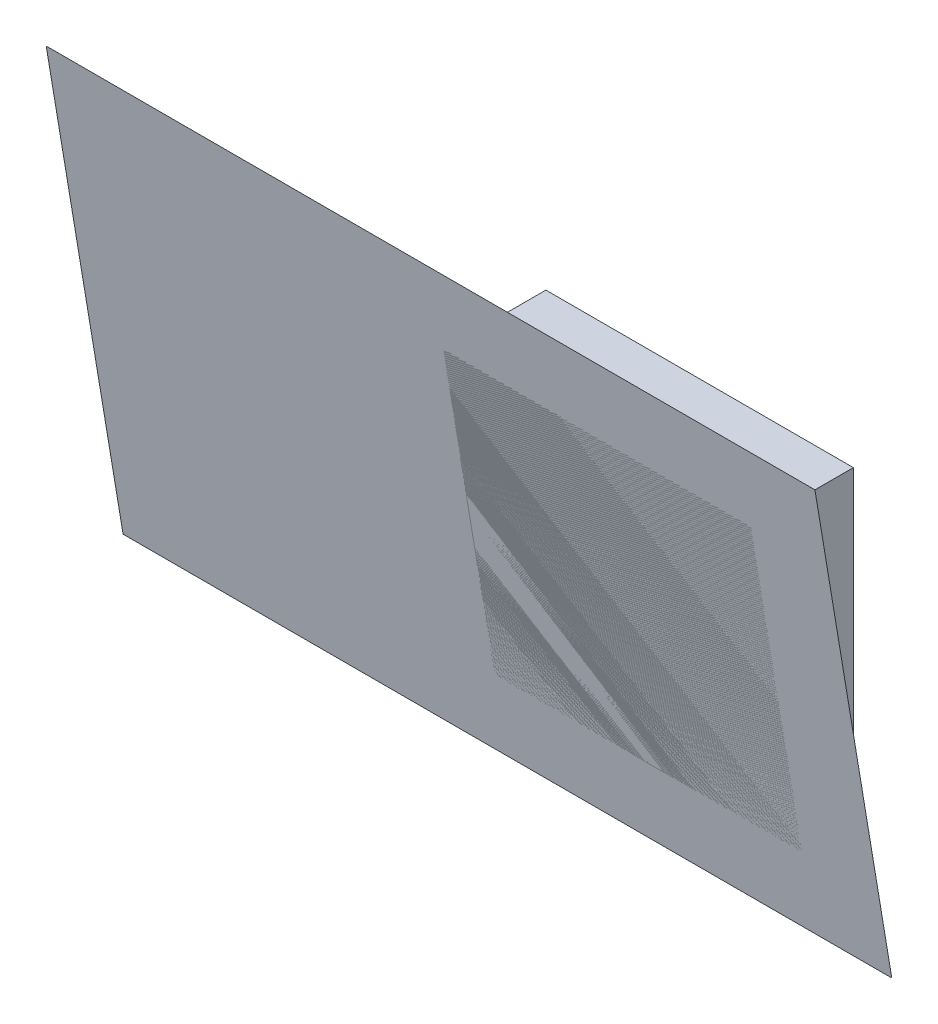
ISO-10303-21;
HEADER;
FILE_DESCRIPTION(('STEP AP214'),'2;1');
FILE_NAME('part.step','',(''),(''),'','','');
FILE_SCHEMA(('AUTOMOTIVE_DESIGN { 1 0 10303 214 1 1 1 1 }'));
ENDSEC;
DATA;
#1=APPLICATION_CONTEXT('core data for automotive mechanical design processes');
#2=APPLICATION_PROTOCOL_DEFINITION('international standard','automotive_design',2000,#1);
#3=PRODUCT_CONTEXT('',#1,'mechanical');
#4=PRODUCT('Part','Part','',(#3));
#5=PRODUCT_RELATED_PRODUCT_CATEGORY('part','',(#4));
#6=PRODUCT_DEFINITION_FORMATION('','',#4);
#7=PRODUCT_DEFINITION_CONTEXT('part definition',#1,'design');
#8=PRODUCT_DEFINITION('design','',#6,#7);
#9=PRODUCT_DEFINITION_SHAPE('','',#8);
#10=(LENGTH_UNIT() NAMED_UNIT(*) SI_UNIT(.MILLI.,.METRE.));
#11=(NAMED_UNIT(*) PLANE_ANGLE_UNIT() SI_UNIT($,.RADIAN.));
#12=(NAMED_UNIT(*) SI_UNIT($,.STERADIAN.) SOLID_ANGLE_UNIT());
#13=UNCERTAINTY_MEASURE_WITH_UNIT(LENGTH_MEASURE(1.E-05),#10,'distance_accuracy_value','');
#14=(GEOMETRIC_REPRESENTATION_CONTEXT(3) GLOBAL_UNCERTAINTY_ASSIGNED_CONTEXT((#13)) GLOBAL_UNIT_ASSIGNED_CONTEXT((#10,
#11,#12)) REPRESENTATION_CONTEXT('',''));
#15=CARTESIAN_POINT('',(0.,0.,0.));
#16=DIRECTION('',(0.,0.,1.));
#17=DIRECTION('',(1.,0.,0.));
#18=AXIS2_PLACEMENT_3D('',#15,#16,#17);
#19=CARTESIAN_POINT('',(0.,-10.,5.));
#20=DIRECTION('',(0.,0.164398987305357,-0.986393923832144));
#21=DIRECTION('',(0.,0.986393923832144,0.164398987305357));
#22=AXIS2_PLACEMENT_3D('',#19,#20,#21);
#23=PLANE('',#22);
#24=DIRECTION('',(0.,0.986393923832144,0.164398987305357));
#25=VECTOR('',#24,1.);
#26=CARTESIAN_POINT('',(50.,-10.,5.));
#27=LINE('',#26,#25);
#28=CARTESIAN_POINT('',(50.,-10.,5.));
#29=VERTEX_POINT('',#28);
#30=CARTESIAN_POINT('',(50.,50.,15.));
#31=VERTEX_POINT('',#30);
#32=EDGE_CURVE('E56',#29,#31,#27,.T.);
#33=ORIENTED_EDGE('',*,*,#32,.F.);
#34=DIRECTION('',(1.,0.,0.));
#35=VECTOR('',#34,1.);
#36=CARTESIAN_POINT('',(0.,-10.,5.));
#37=LINE('',#36,#35);
#38=CARTESIAN_POINT('',(-50.,-10.,5.));
#39=VERTEX_POINT('',#38);
#40=EDGE_CURVE('E48',#39,#29,#37,.T.);
#41=ORIENTED_EDGE('',*,*,#40,.F.);
#42=DIRECTION('',(0.,0.986393923832144,0.164398987305357));
#43=VECTOR('',#42,1.);
#44=CARTESIAN_POINT('',(-50.,-10.,5.));
#45=LINE('',#44,#43);
#46=CARTESIAN_POINT('',(-50.,50.,15.));
#47=VERTEX_POINT('',#46);
#48=EDGE_CURVE('E66',#39,#47,#45,.T.);
#49=ORIENTED_EDGE('',*,*,#48,.T.);
#50=DIRECTION('',(1.,0.,0.));
#51=VECTOR('',#50,1.);
#52=CARTESIAN_POINT('',(0.,50.,15.));
#53=LINE('',#52,#51);
#54=EDGE_CURVE('E12',#47,#31,#53,.T.);
#55=ORIENTED_EDGE('',*,*,#54,.T.);
#56=EDGE_LOOP('',(#33,#41,#49,#55));
#57=FACE_BOUND('',#56,.T.);
#58=ADVANCED_FACE('F47',(#57),#23,.T.);
#59=OPEN_SHELL('',(#58));
#60=SHELL_BASED_SURFACE_MODEL('B2',(#59));
#61=CARTESIAN_POINT('',(0.,-10.,5.));
#62=DIRECTION('',(0.,0.164398987305357,-0.986393923832144));
#63=DIRECTION('',(0.,0.986393923832144,0.164398987305357));
#64=AXIS2_PLACEMENT_3D('',#61,#62,#63);
#65=PLANE('',#64);
#66=DIRECTION('',(0.,0.986393923832144,0.164398987305357));
#67=VECTOR('',#66,1.);
#68=CARTESIAN_POINT('',(0.,2.16216216216216,7.02702702702703));
#69=LINE('',#68,#67);
#70=CARTESIAN_POINT('',(0.,0.,6.66666666666667));
#71=VERTEX_POINT('',#70);
#72=CARTESIAN_POINT('',(0.,40.,13.3333333333333));
#73=VERTEX_POINT('',#72);
#74=EDGE_CURVE('E130',#71,#73,#69,.T.);
#75=ORIENTED_EDGE('',*,*,#74,.F.);
#76=DIRECTION('',(-1.,0.,0.));
#77=VECTOR('',#76,1.);
#78=CARTESIAN_POINT('',(0.,0.,6.66666666666667));
#79=LINE('',#78,#77);
#80=CARTESIAN_POINT('',(40.,0.,6.66666666666667));
#81=VERTEX_POINT('',#80);
#82=EDGE_CURVE('E136',#81,#71,#79,.T.);
#83=ORIENTED_EDGE('',*,*,#82,.F.);
#84=DIRECTION('',(0.,-0.986393923832144,-0.164398987305357));
#85=VECTOR('',#84,1.);
#86=CARTESIAN_POINT('',(40.,2.16216216216216,7.02702702702703));
#87=LINE('',#86,#85);
#88=CARTESIAN_POINT('',(40.,40.,13.3333333333333));
#89=VERTEX_POINT('',#88);
#90=EDGE_CURVE('E106',#89,#81,#87,.T.);
#91=ORIENTED_EDGE('',*,*,#90,.F.);
#92=DIRECTION('',(1.,0.,0.));
#93=VECTOR('',#92,1.);
#94=CARTESIAN_POINT('',(0.,40.,13.3333333333333));
#95=LINE('',#94,#93);
#96=EDGE_CURVE('E45',#73,#89,#95,.T.);
#97=ORIENTED_EDGE('',*,*,#96,.F.);
#98=EDGE_LOOP('',(#75,#83,#91,#97));
#99=FACE_BOUND('',#98,.T.);
#100=ADVANCED_FACE('F91',(#99),#65,.F.);
#101=CARTESIAN_POINT('',(0.,0.,20.));
#102=DIRECTION('',(1.,0.,0.));
#103=DIRECTION('',(0.,0.,-1.));
#104=AXIS2_PLACEMENT_3D('',#101,#102,#103);
#105=PLANE('',#104);
#106=DIRECTION('',(0.,0.,-1.));
#107=VECTOR('',#106,1.);
#108=CARTESIAN_POINT('',(0.,0.,20.));
#109=LINE('',#108,#107);
#110=CARTESIAN_POINT('',(0.,0.,0.));
#111=VERTEX_POINT('',#110);
#112=EDGE_CURVE('E99',#71,#111,#109,.T.);
#113=ORIENTED_EDGE('',*,*,#112,.F.);
#114=ORIENTED_EDGE('',*,*,#74,.T.);
#115=DIRECTION('',(0.,0.,-1.));
#116=VECTOR('',#115,1.);
#117=CARTESIAN_POINT('',(0.,40.,20.));
#118=LINE('',#117,#116);
#119=CARTESIAN_POINT('',(0.,40.,0.));
#120=VERTEX_POINT('',#119);
#121=EDGE_CURVE('E113',#73,#120,#118,.T.);
#122=ORIENTED_EDGE('',*,*,#121,.T.);
#123=DIRECTION('',(0.,-1.,0.));
#124=VECTOR('',#123,1.);
#125=CARTESIAN_POINT('',(0.,0.,0.));
#126=LINE('',#125,#124);
#127=EDGE_CURVE('E135',#120,#111,#126,.T.);
#128=ORIENTED_EDGE('',*,*,#127,.T.);
#129=EDGE_LOOP('',(#113,#114,#122,#128));
#130=FACE_BOUND('',#129,.T.);
#131=ADVANCED_FACE('F93',(#130),#105,.F.);
#132=CARTESIAN_POINT('',(0.,0.,20.));
#133=DIRECTION('',(0.,1.,0.));
#134=DIRECTION('',(0.,0.,1.));
#135=AXIS2_PLACEMENT_3D('',#132,#133,#134);
#136=PLANE('',#135);
#137=DIRECTION('',(0.,0.,-1.));
#138=VECTOR('',#137,1.);
#139=CARTESIAN_POINT('',(40.,0.,20.));
#140=LINE('',#139,#138);
#141=CARTESIAN_POINT('',(40.,0.,0.));
#142=VERTEX_POINT('',#141);
#143=EDGE_CURVE('E144',#81,#142,#140,.T.);
#144=ORIENTED_EDGE('',*,*,#143,.F.);
#145=ORIENTED_EDGE('',*,*,#82,.T.);
#146=ORIENTED_EDGE('',*,*,#112,.T.);
#147=DIRECTION('',(1.,0.,0.));
#148=VECTOR('',#147,1.);
#149=CARTESIAN_POINT('',(0.,0.,0.));
#150=LINE('',#149,#148);
#151=EDGE_CURVE('E155',#111,#142,#150,.T.);
#152=ORIENTED_EDGE('',*,*,#151,.T.);
#153=EDGE_LOOP('',(#144,#145,#146,#152));
#154=FACE_BOUND('',#153,.T.);
#155=ADVANCED_FACE('F154',(#154),#136,.F.);
#156=CARTESIAN_POINT('',(40.,0.,20.));
#157=DIRECTION('',(-1.,0.,0.));
#158=DIRECTION('',(0.,0.,1.));
#159=AXIS2_PLACEMENT_3D('',#156,#157,#158);
#160=PLANE('',#159);
#161=DIRECTION('',(0.,0.,-1.));
#162=VECTOR('',#161,1.);
#163=CARTESIAN_POINT('',(40.,40.,20.));
#164=LINE('',#163,#162);
#165=CARTESIAN_POINT('',(40.,40.,0.));
#166=VERTEX_POINT('',#165);
#167=EDGE_CURVE('E142',#89,#166,#164,.T.);
#168=ORIENTED_EDGE('',*,*,#167,.F.);
#169=ORIENTED_EDGE('',*,*,#90,.T.);
#170=ORIENTED_EDGE('',*,*,#143,.T.);
#171=DIRECTION('',(0.,1.,0.));
#172=VECTOR('',#171,1.);
#173=CARTESIAN_POINT('',(40.,0.,0.));
#174=LINE('',#173,#172);
#175=EDGE_CURVE('E146',#142,#166,#174,.T.);
#176=ORIENTED_EDGE('',*,*,#175,.T.);
#177=EDGE_LOOP('',(#168,#169,#170,#176));
#178=FACE_BOUND('',#177,.T.);
#179=ADVANCED_FACE('F164',(#178),#160,.F.);
#180=CARTESIAN_POINT('',(0.,40.,20.));
#181=DIRECTION('',(0.,-1.,0.));
#182=DIRECTION('',(0.,0.,-1.));
#183=AXIS2_PLACEMENT_3D('',#180,#181,#182);
#184=PLANE('',#183);
#185=ORIENTED_EDGE('',*,*,#121,.F.);
#186=ORIENTED_EDGE('',*,*,#96,.T.);
#187=ORIENTED_EDGE('',*,*,#167,.T.);
#188=DIRECTION('',(-1.,0.,0.));
#189=VECTOR('',#188,1.);
#190=CARTESIAN_POINT('',(0.,40.,0.));
#191=LINE('',#190,#189);
#192=EDGE_CURVE('E140',#166,#120,#191,.T.);
#193=ORIENTED_EDGE('',*,*,#192,.T.);
#194=EDGE_LOOP('',(#185,#186,#187,#193));
#195=FACE_BOUND('',#194,.T.);
#196=ADVANCED_FACE('F138',(#195),#184,.F.);
#197=CARTESIAN_POINT('',(0.,0.,0.));
#198=DIRECTION('',(0.,0.,-1.));
#199=DIRECTION('',(-1.,0.,0.));
#200=AXIS2_PLACEMENT_3D('',#197,#198,#199);
#201=PLANE('',#200);
#202=ORIENTED_EDGE('',*,*,#127,.F.);
#203=ORIENTED_EDGE('',*,*,#192,.F.);
#204=ORIENTED_EDGE('',*,*,#175,.F.);
#205=ORIENTED_EDGE('',*,*,#151,.F.);
#206=EDGE_LOOP('',(#202,#203,#204,#205));
#207=FACE_BOUND('',#206,.T.);
#208=ADVANCED_FACE('F158',(#207),#201,.T.);
#209=CLOSED_SHELL('',(#100,#131,#155,#179,#196,#208));
#210=MANIFOLD_SOLID_BREP('B6',#209);
#211=ADVANCED_BREP_SHAPE_REPRESENTATION('',(#18,#210),#14);
#212=MANIFOLD_SURFACE_SHAPE_REPRESENTATION('',(#18,#60),#14);
#213=SHAPE_REPRESENTATION('',(#18),#14);
#214=SHAPE_DEFINITION_REPRESENTATION(#9,#213);
#215=SHAPE_REPRESENTATION_RELATIONSHIP('','',#213,#211);
#216=SHAPE_REPRESENTATION_RELATIONSHIP('','',#213,#212);
ENDSEC;
END-ISO-10303-21;
